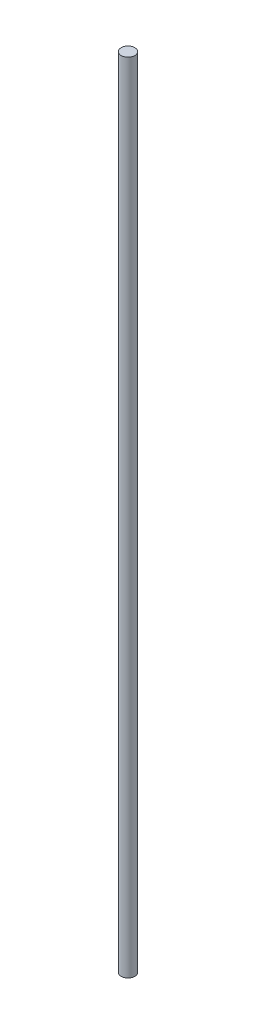
ISO-10303-21;
HEADER;
FILE_DESCRIPTION(('STEP AP214'),'2;1');
FILE_NAME('part.step','',(''),(''),'','','');
FILE_SCHEMA(('AUTOMOTIVE_DESIGN { 1 0 10303 214 1 1 1 1 }'));
ENDSEC;
DATA;
#1=APPLICATION_CONTEXT('core data for automotive mechanical design processes');
#2=APPLICATION_PROTOCOL_DEFINITION('international standard','automotive_design',2000,#1);
#3=PRODUCT_CONTEXT('',#1,'mechanical');
#4=PRODUCT('Part','Part','',(#3));
#5=PRODUCT_RELATED_PRODUCT_CATEGORY('part','',(#4));
#6=PRODUCT_DEFINITION_FORMATION('','',#4);
#7=PRODUCT_DEFINITION_CONTEXT('part definition',#1,'design');
#8=PRODUCT_DEFINITION('design','',#6,#7);
#9=PRODUCT_DEFINITION_SHAPE('','',#8);
#10=(LENGTH_UNIT() NAMED_UNIT(*) SI_UNIT(.MILLI.,.METRE.));
#11=(NAMED_UNIT(*) PLANE_ANGLE_UNIT() SI_UNIT($,.RADIAN.));
#12=(NAMED_UNIT(*) SI_UNIT($,.STERADIAN.) SOLID_ANGLE_UNIT());
#13=UNCERTAINTY_MEASURE_WITH_UNIT(LENGTH_MEASURE(1.E-05),#10,'distance_accuracy_value','');
#14=(GEOMETRIC_REPRESENTATION_CONTEXT(3) GLOBAL_UNCERTAINTY_ASSIGNED_CONTEXT((#13)) GLOBAL_UNIT_ASSIGNED_CONTEXT((#10,
#11,#12)) REPRESENTATION_CONTEXT('',''));
#15=CARTESIAN_POINT('',(0.,0.,0.));
#16=DIRECTION('',(0.,0.,1.));
#17=DIRECTION('',(1.,0.,0.));
#18=AXIS2_PLACEMENT_3D('',#15,#16,#17);
#19=CARTESIAN_POINT('',(0.,87.5,0.));
#20=DIRECTION('',(0.,-1.,0.));
#21=DIRECTION('',(0.,0.,-1.));
#22=AXIS2_PLACEMENT_3D('',#19,#20,#21);
#23=CYLINDRICAL_SURFACE('',#22,1.5);
#24=CARTESIAN_POINT('',(0.,87.5,0.));
#25=DIRECTION('',(0.,1.,0.));
#26=DIRECTION('',(0.,0.,1.));
#27=AXIS2_PLACEMENT_3D('',#24,#25,#26);
#28=CIRCLE('',#27,1.5);
#29=CARTESIAN_POINT('',(0.,87.5,1.5));
#30=VERTEX_POINT('',#29);
#31=EDGE_CURVE('E10',#30,#30,#28,.T.);
#32=ORIENTED_EDGE('',*,*,#31,.F.);
#33=EDGE_LOOP('',(#32));
#34=FACE_BOUND('',#33,.T.);
#35=CARTESIAN_POINT('',(0.,-87.5,0.));
#36=DIRECTION('',(0.,1.,0.));
#37=DIRECTION('',(0.,0.,1.));
#38=AXIS2_PLACEMENT_3D('',#35,#36,#37);
#39=CIRCLE('',#38,1.5);
#40=CARTESIAN_POINT('',(0.,-87.5,1.5));
#41=VERTEX_POINT('',#40);
#42=EDGE_CURVE('E40',#41,#41,#39,.T.);
#43=ORIENTED_EDGE('',*,*,#42,.T.);
#44=EDGE_LOOP('',(#43));
#45=FACE_BOUND('',#44,.T.);
#46=ADVANCED_FACE('F37',(#34,#45),#23,.T.);
#47=CARTESIAN_POINT('',(0.,87.5,0.));
#48=DIRECTION('',(0.,1.,0.));
#49=DIRECTION('',(0.,0.,1.));
#50=AXIS2_PLACEMENT_3D('',#47,#48,#49);
#51=PLANE('',#50);
#52=ORIENTED_EDGE('',*,*,#31,.T.);
#53=EDGE_LOOP('',(#52));
#54=FACE_BOUND('',#53,.T.);
#55=ADVANCED_FACE('F54',(#54),#51,.T.);
#56=CARTESIAN_POINT('',(0.,-87.5,0.));
#57=DIRECTION('',(0.,1.,0.));
#58=DIRECTION('',(0.,0.,1.));
#59=AXIS2_PLACEMENT_3D('',#56,#57,#58);
#60=PLANE('',#59);
#61=ORIENTED_EDGE('',*,*,#42,.F.);
#62=EDGE_LOOP('',(#61));
#63=FACE_BOUND('',#62,.T.);
#64=ADVANCED_FACE('F52',(#63),#60,.F.);
#65=CLOSED_SHELL('',(#46,#55,#64));
#66=MANIFOLD_SOLID_BREP('B2',#65);
#67=ADVANCED_BREP_SHAPE_REPRESENTATION('',(#18,#66),#14);
#68=SHAPE_DEFINITION_REPRESENTATION(#9,#67);
ENDSEC;
END-ISO-10303-21;
